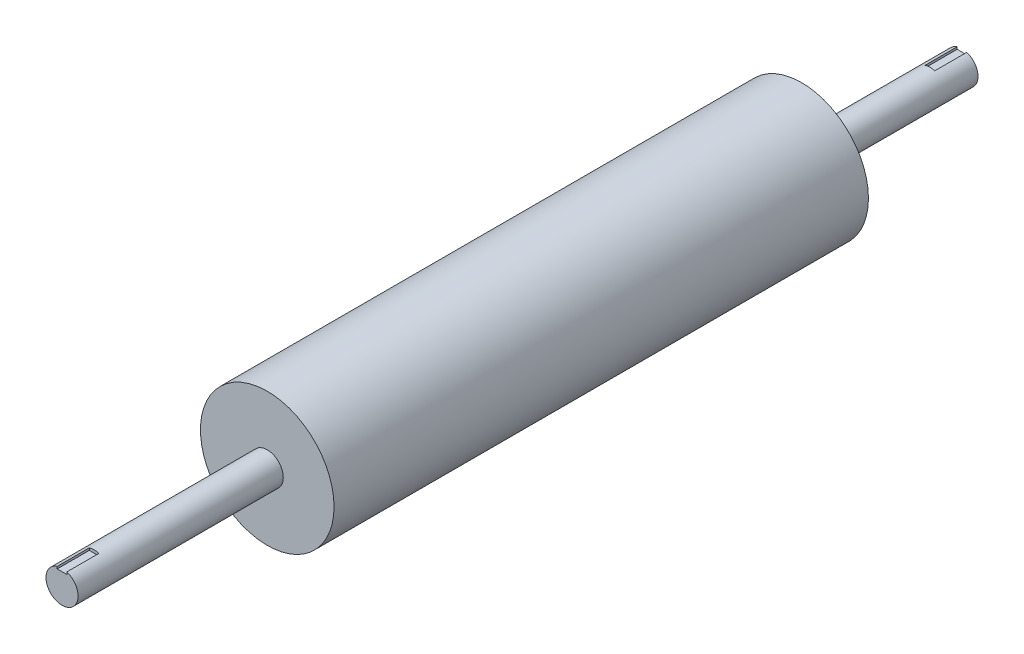
ISO-10303-21;
HEADER;
FILE_DESCRIPTION(('STEP AP214'),'2;1');
FILE_NAME('part.step','',(''),(''),'','','');
FILE_SCHEMA(('AUTOMOTIVE_DESIGN { 1 0 10303 214 1 1 1 1 }'));
ENDSEC;
DATA;
#1=APPLICATION_CONTEXT('core data for automotive mechanical design processes');
#2=APPLICATION_PROTOCOL_DEFINITION('international standard','automotive_design',2000,#1);
#3=PRODUCT_CONTEXT('',#1,'mechanical');
#4=PRODUCT('Part','Part','',(#3));
#5=PRODUCT_RELATED_PRODUCT_CATEGORY('part','',(#4));
#6=PRODUCT_DEFINITION_FORMATION('','',#4);
#7=PRODUCT_DEFINITION_CONTEXT('part definition',#1,'design');
#8=PRODUCT_DEFINITION('design','',#6,#7);
#9=PRODUCT_DEFINITION_SHAPE('','',#8);
#10=(LENGTH_UNIT() NAMED_UNIT(*) SI_UNIT(.MILLI.,.METRE.));
#11=(NAMED_UNIT(*) PLANE_ANGLE_UNIT() SI_UNIT($,.RADIAN.));
#12=(NAMED_UNIT(*) SI_UNIT($,.STERADIAN.) SOLID_ANGLE_UNIT());
#13=UNCERTAINTY_MEASURE_WITH_UNIT(LENGTH_MEASURE(1.E-05),#10,'distance_accuracy_value','');
#14=(GEOMETRIC_REPRESENTATION_CONTEXT(3) GLOBAL_UNCERTAINTY_ASSIGNED_CONTEXT((#13)) GLOBAL_UNIT_ASSIGNED_CONTEXT((#10,
#11,#12)) REPRESENTATION_CONTEXT('',''));
#15=CARTESIAN_POINT('',(0.,0.,0.));
#16=DIRECTION('',(0.,0.,1.));
#17=DIRECTION('',(1.,0.,0.));
#18=AXIS2_PLACEMENT_3D('',#15,#16,#17);
#19=CARTESIAN_POINT('',(0.,0.,1000.));
#20=DIRECTION('',(0.,0.,-1.));
#21=DIRECTION('',(-1.,0.,0.));
#22=AXIS2_PLACEMENT_3D('',#19,#20,#21);
#23=CYLINDRICAL_SURFACE('',#22,125.);
#24=CARTESIAN_POINT('',(0.,0.,1000.));
#25=DIRECTION('',(0.,0.,1.));
#26=DIRECTION('',(1.,0.,0.));
#27=AXIS2_PLACEMENT_3D('',#24,#25,#26);
#28=CIRCLE('',#27,125.);
#29=CARTESIAN_POINT('',(125.,0.,1000.));
#30=VERTEX_POINT('',#29);
#31=EDGE_CURVE('E206',#30,#30,#28,.T.);
#32=ORIENTED_EDGE('',*,*,#31,.F.);
#33=EDGE_LOOP('',(#32));
#34=FACE_BOUND('',#33,.T.);
#35=CARTESIAN_POINT('',(0.,0.,0.));
#36=DIRECTION('',(0.,0.,1.));
#37=DIRECTION('',(1.,0.,0.));
#38=AXIS2_PLACEMENT_3D('',#35,#36,#37);
#39=CIRCLE('',#38,125.);
#40=CARTESIAN_POINT('',(125.,0.,0.));
#41=VERTEX_POINT('',#40);
#42=EDGE_CURVE('E202',#41,#41,#39,.T.);
#43=ORIENTED_EDGE('',*,*,#42,.T.);
#44=EDGE_LOOP('',(#43));
#45=FACE_BOUND('',#44,.T.);
#46=ADVANCED_FACE('F53',(#34,#45),#23,.T.);
#47=CARTESIAN_POINT('',(0.,0.,1000.));
#48=DIRECTION('',(0.,0.,1.));
#49=DIRECTION('',(1.,0.,0.));
#50=AXIS2_PLACEMENT_3D('',#47,#48,#49);
#51=PLANE('',#50);
#52=CARTESIAN_POINT('',(0.,0.,1000.));
#53=DIRECTION('',(0.,0.,1.));
#54=DIRECTION('',(1.,0.,0.));
#55=AXIS2_PLACEMENT_3D('',#52,#53,#54);
#56=CIRCLE('',#55,30.);
#57=CARTESIAN_POINT('',(30.,0.,1000.));
#58=VERTEX_POINT('',#57);
#59=EDGE_CURVE('E198',#58,#58,#56,.T.);
#60=ORIENTED_EDGE('',*,*,#59,.F.);
#61=EDGE_LOOP('',(#60));
#62=FACE_BOUND('',#61,.T.);
#63=ORIENTED_EDGE('',*,*,#31,.T.);
#64=EDGE_LOOP('',(#63));
#65=FACE_BOUND('',#64,.T.);
#66=ADVANCED_FACE('F250',(#62,#65),#51,.T.);
#67=CARTESIAN_POINT('',(0.,0.,0.));
#68=DIRECTION('',(0.,0.,1.));
#69=DIRECTION('',(1.,0.,0.));
#70=AXIS2_PLACEMENT_3D('',#67,#68,#69);
#71=PLANE('',#70);
#72=CARTESIAN_POINT('',(0.,0.,0.));
#73=DIRECTION('',(0.,0.,-1.));
#74=DIRECTION('',(-1.,0.,0.));
#75=AXIS2_PLACEMENT_3D('',#72,#73,#74);
#76=CIRCLE('',#75,30.);
#77=CARTESIAN_POINT('',(-30.,0.,0.));
#78=VERTEX_POINT('',#77);
#79=EDGE_CURVE('E193',#78,#78,#76,.T.);
#80=ORIENTED_EDGE('',*,*,#79,.F.);
#81=EDGE_LOOP('',(#80));
#82=FACE_BOUND('',#81,.T.);
#83=ORIENTED_EDGE('',*,*,#42,.F.);
#84=EDGE_LOOP('',(#83));
#85=FACE_BOUND('',#84,.T.);
#86=ADVANCED_FACE('F247',(#82,#85),#71,.F.);
#87=CARTESIAN_POINT('',(0.,0.,1384.03));
#88=DIRECTION('',(0.,0.,-1.));
#89=DIRECTION('',(-1.,0.,0.));
#90=AXIS2_PLACEMENT_3D('',#87,#88,#89);
#91=CYLINDRICAL_SURFACE('',#90,30.);
#92=CARTESIAN_POINT('',(0.,0.,1324.03));
#93=DIRECTION('',(0.,0.,-1.));
#94=DIRECTION('',(-1.,0.,0.));
#95=AXIS2_PLACEMENT_3D('',#92,#93,#94);
#96=CIRCLE('',#95,30.);
#97=CARTESIAN_POINT('',(-9.00000000000001,28.6181760425084,1324.03));
#98=VERTEX_POINT('',#97);
#99=CARTESIAN_POINT('',(8.99999999999999,28.6181760425084,1324.03));
#100=VERTEX_POINT('',#99);
#101=EDGE_CURVE('E215',#98,#100,#96,.T.);
#102=ORIENTED_EDGE('',*,*,#101,.T.);
#103=DIRECTION('',(0.,0.,-1.));
#104=VECTOR('',#103,1.);
#105=CARTESIAN_POINT('',(8.99999999999999,28.6181760425084,1384.03));
#106=LINE('',#105,#104);
#107=CARTESIAN_POINT('',(8.99999999999999,28.6181760425084,1384.03));
#108=VERTEX_POINT('',#107);
#109=EDGE_CURVE('E184',#100,#108,#106,.F.);
#110=ORIENTED_EDGE('',*,*,#109,.T.);
#111=CARTESIAN_POINT('',(0.,0.,1384.03));
#112=DIRECTION('',(0.,0.,1.));
#113=DIRECTION('',(1.,0.,0.));
#114=AXIS2_PLACEMENT_3D('',#111,#112,#113);
#115=CIRCLE('',#114,30.);
#116=CARTESIAN_POINT('',(-9.00000000000001,28.6181760425084,1384.03));
#117=VERTEX_POINT('',#116);
#118=EDGE_CURVE('E192',#117,#108,#115,.T.);
#119=ORIENTED_EDGE('',*,*,#118,.F.);
#120=DIRECTION('',(0.,0.,-1.));
#121=VECTOR('',#120,1.);
#122=CARTESIAN_POINT('',(-9.00000000000001,28.6181760425084,1384.03));
#123=LINE('',#122,#121);
#124=EDGE_CURVE('E76',#117,#98,#123,.T.);
#125=ORIENTED_EDGE('',*,*,#124,.T.);
#126=EDGE_LOOP('',(#102,#110,#119,#125));
#127=FACE_BOUND('',#126,.T.);
#128=ORIENTED_EDGE('',*,*,#59,.T.);
#129=EDGE_LOOP('',(#128));
#130=FACE_BOUND('',#129,.T.);
#131=ADVANCED_FACE('F220',(#127,#130),#91,.T.);
#132=CARTESIAN_POINT('',(0.,0.,1384.03));
#133=DIRECTION('',(0.,0.,1.));
#134=DIRECTION('',(1.,0.,0.));
#135=AXIS2_PLACEMENT_3D('',#132,#133,#134);
#136=PLANE('',#135);
#137=DIRECTION('',(0.,1.,0.));
#138=VECTOR('',#137,1.);
#139=CARTESIAN_POINT('',(8.99999999999999,24.5,1384.03));
#140=LINE('',#139,#138);
#141=CARTESIAN_POINT('',(8.99999999999999,24.5,1384.03));
#142=VERTEX_POINT('',#141);
#143=EDGE_CURVE('E157',#142,#108,#140,.T.);
#144=ORIENTED_EDGE('',*,*,#143,.F.);
#145=DIRECTION('',(1.,0.,0.));
#146=VECTOR('',#145,1.);
#147=CARTESIAN_POINT('',(-9.00000000000001,24.5,1384.03));
#148=LINE('',#147,#146);
#149=CARTESIAN_POINT('',(-9.00000000000001,24.5,1384.03));
#150=VERTEX_POINT('',#149);
#151=EDGE_CURVE('E163',#150,#142,#148,.T.);
#152=ORIENTED_EDGE('',*,*,#151,.F.);
#153=DIRECTION('',(0.,-1.,0.));
#154=VECTOR('',#153,1.);
#155=CARTESIAN_POINT('',(-9.00000000000001,0.,1384.03));
#156=LINE('',#155,#154);
#157=EDGE_CURVE('E197',#117,#150,#156,.T.);
#158=ORIENTED_EDGE('',*,*,#157,.F.);
#159=ORIENTED_EDGE('',*,*,#118,.T.);
#160=EDGE_LOOP('',(#144,#152,#158,#159));
#161=FACE_BOUND('',#160,.T.);
#162=ADVANCED_FACE('F236',(#161),#136,.T.);
#163=CARTESIAN_POINT('',(0.,0.,-300.));
#164=DIRECTION('',(0.,0.,1.));
#165=DIRECTION('',(1.,0.,0.));
#166=AXIS2_PLACEMENT_3D('',#163,#164,#165);
#167=CYLINDRICAL_SURFACE('',#166,30.);
#168=CARTESIAN_POINT('',(0.,0.,-240.));
#169=DIRECTION('',(0.,0.,1.));
#170=DIRECTION('',(1.,0.,0.));
#171=AXIS2_PLACEMENT_3D('',#168,#169,#170);
#172=CIRCLE('',#171,30.);
#173=CARTESIAN_POINT('',(9.,28.6181760425084,-240.));
#174=VERTEX_POINT('',#173);
#175=CARTESIAN_POINT('',(-9.,28.6181760425084,-240.));
#176=VERTEX_POINT('',#175);
#177=EDGE_CURVE('E11',#174,#176,#172,.T.);
#178=ORIENTED_EDGE('',*,*,#177,.T.);
#179=DIRECTION('',(0.,0.,1.));
#180=VECTOR('',#179,1.);
#181=CARTESIAN_POINT('',(-9.,28.6181760425084,-300.));
#182=LINE('',#181,#180);
#183=CARTESIAN_POINT('',(-9.,28.6181760425084,-300.));
#184=VERTEX_POINT('',#183);
#185=EDGE_CURVE('E153',#176,#184,#182,.F.);
#186=ORIENTED_EDGE('',*,*,#185,.T.);
#187=CARTESIAN_POINT('',(0.,0.,-300.));
#188=DIRECTION('',(0.,0.,-1.));
#189=DIRECTION('',(-1.,0.,0.));
#190=AXIS2_PLACEMENT_3D('',#187,#188,#189);
#191=CIRCLE('',#190,30.);
#192=CARTESIAN_POINT('',(9.,28.6181760425084,-300.));
#193=VERTEX_POINT('',#192);
#194=EDGE_CURVE('E188',#193,#184,#191,.T.);
#195=ORIENTED_EDGE('',*,*,#194,.F.);
#196=DIRECTION('',(0.,0.,1.));
#197=VECTOR('',#196,1.);
#198=CARTESIAN_POINT('',(9.,28.6181760425084,-300.));
#199=LINE('',#198,#197);
#200=EDGE_CURVE('E68',#193,#174,#199,.T.);
#201=ORIENTED_EDGE('',*,*,#200,.T.);
#202=EDGE_LOOP('',(#178,#186,#195,#201));
#203=FACE_BOUND('',#202,.T.);
#204=ORIENTED_EDGE('',*,*,#79,.T.);
#205=EDGE_LOOP('',(#204));
#206=FACE_BOUND('',#205,.T.);
#207=ADVANCED_FACE('F238',(#203,#206),#167,.T.);
#208=CARTESIAN_POINT('',(0.,0.,-300.));
#209=DIRECTION('',(0.,0.,-1.));
#210=DIRECTION('',(-1.,0.,0.));
#211=AXIS2_PLACEMENT_3D('',#208,#209,#210);
#212=PLANE('',#211);
#213=DIRECTION('',(0.,1.,0.));
#214=VECTOR('',#213,1.);
#215=CARTESIAN_POINT('',(-9.,24.5,-300.));
#216=LINE('',#215,#214);
#217=CARTESIAN_POINT('',(-9.,24.5,-300.));
#218=VERTEX_POINT('',#217);
#219=EDGE_CURVE('E143',#218,#184,#216,.T.);
#220=ORIENTED_EDGE('',*,*,#219,.F.);
#221=DIRECTION('',(-1.,0.,0.));
#222=VECTOR('',#221,1.);
#223=CARTESIAN_POINT('',(9.,24.5,-300.));
#224=LINE('',#223,#222);
#225=CARTESIAN_POINT('',(9.,24.5,-300.));
#226=VERTEX_POINT('',#225);
#227=EDGE_CURVE('E146',#226,#218,#224,.T.);
#228=ORIENTED_EDGE('',*,*,#227,.F.);
#229=DIRECTION('',(0.,-1.,0.));
#230=VECTOR('',#229,1.);
#231=CARTESIAN_POINT('',(9.,0.,-300.));
#232=LINE('',#231,#230);
#233=EDGE_CURVE('E61',#193,#226,#232,.T.);
#234=ORIENTED_EDGE('',*,*,#233,.F.);
#235=ORIENTED_EDGE('',*,*,#194,.T.);
#236=EDGE_LOOP('',(#220,#228,#234,#235));
#237=FACE_BOUND('',#236,.T.);
#238=ADVANCED_FACE('F244',(#237),#212,.T.);
#239=CARTESIAN_POINT('',(0.,0.,1324.03));
#240=DIRECTION('',(0.,0.,-1.));
#241=DIRECTION('',(-1.,0.,0.));
#242=AXIS2_PLACEMENT_3D('',#239,#240,#241);
#243=PLANE('',#242);
#244=DIRECTION('',(0.,-1.,0.));
#245=VECTOR('',#244,1.);
#246=CARTESIAN_POINT('',(-9.00000000000001,24.5,1324.03));
#247=LINE('',#246,#245);
#248=CARTESIAN_POINT('',(-9.00000000000001,24.5,1324.03));
#249=VERTEX_POINT('',#248);
#250=EDGE_CURVE('E162',#98,#249,#247,.T.);
#251=ORIENTED_EDGE('',*,*,#250,.T.);
#252=DIRECTION('',(1.,0.,0.));
#253=VECTOR('',#252,1.);
#254=CARTESIAN_POINT('',(-9.00000000000001,24.5,1324.03));
#255=LINE('',#254,#253);
#256=CARTESIAN_POINT('',(8.99999999999999,24.5,1324.03));
#257=VERTEX_POINT('',#256);
#258=EDGE_CURVE('E166',#249,#257,#255,.T.);
#259=ORIENTED_EDGE('',*,*,#258,.T.);
#260=DIRECTION('',(0.,1.,0.));
#261=VECTOR('',#260,1.);
#262=CARTESIAN_POINT('',(8.99999999999999,24.5,1324.03));
#263=LINE('',#262,#261);
#264=EDGE_CURVE('E158',#257,#100,#263,.T.);
#265=ORIENTED_EDGE('',*,*,#264,.T.);
#266=ORIENTED_EDGE('',*,*,#101,.F.);
#267=EDGE_LOOP('',(#251,#259,#265,#266));
#268=FACE_BOUND('',#267,.T.);
#269=ADVANCED_FACE('F224',(#268),#243,.F.);
#270=CARTESIAN_POINT('',(8.99999999999999,24.5,1324.03));
#271=DIRECTION('',(1.,0.,0.));
#272=DIRECTION('',(0.,0.,-1.));
#273=AXIS2_PLACEMENT_3D('',#270,#271,#272);
#274=PLANE('',#273);
#275=ORIENTED_EDGE('',*,*,#264,.F.);
#276=DIRECTION('',(0.,0.,1.));
#277=VECTOR('',#276,1.);
#278=CARTESIAN_POINT('',(8.99999999999999,24.5,1324.03));
#279=LINE('',#278,#277);
#280=EDGE_CURVE('E176',#257,#142,#279,.T.);
#281=ORIENTED_EDGE('',*,*,#280,.T.);
#282=ORIENTED_EDGE('',*,*,#143,.T.);
#283=ORIENTED_EDGE('',*,*,#109,.F.);
#284=EDGE_LOOP('',(#275,#281,#282,#283));
#285=FACE_BOUND('',#284,.T.);
#286=ADVANCED_FACE('F234',(#285),#274,.F.);
#287=CARTESIAN_POINT('',(-9.00000000000001,24.5,1324.03));
#288=DIRECTION('',(-1.,0.,0.));
#289=DIRECTION('',(0.,0.,1.));
#290=AXIS2_PLACEMENT_3D('',#287,#288,#289);
#291=PLANE('',#290);
#292=ORIENTED_EDGE('',*,*,#157,.T.);
#293=DIRECTION('',(0.,0.,1.));
#294=VECTOR('',#293,1.);
#295=CARTESIAN_POINT('',(-9.00000000000001,24.5,1324.03));
#296=LINE('',#295,#294);
#297=EDGE_CURVE('E170',#249,#150,#296,.T.);
#298=ORIENTED_EDGE('',*,*,#297,.F.);
#299=ORIENTED_EDGE('',*,*,#250,.F.);
#300=ORIENTED_EDGE('',*,*,#124,.F.);
#301=EDGE_LOOP('',(#292,#298,#299,#300));
#302=FACE_BOUND('',#301,.T.);
#303=ADVANCED_FACE('F227',(#302),#291,.F.);
#304=CARTESIAN_POINT('',(-9.00000000000001,24.5,1324.03));
#305=DIRECTION('',(0.,-1.,0.));
#306=DIRECTION('',(0.,0.,-1.));
#307=AXIS2_PLACEMENT_3D('',#304,#305,#306);
#308=PLANE('',#307);
#309=ORIENTED_EDGE('',*,*,#151,.T.);
#310=ORIENTED_EDGE('',*,*,#280,.F.);
#311=ORIENTED_EDGE('',*,*,#258,.F.);
#312=ORIENTED_EDGE('',*,*,#297,.T.);
#313=EDGE_LOOP('',(#309,#310,#311,#312));
#314=FACE_BOUND('',#313,.T.);
#315=ADVANCED_FACE('F231',(#314),#308,.F.);
#316=CARTESIAN_POINT('',(0.,0.,-240.));
#317=DIRECTION('',(0.,0.,1.));
#318=DIRECTION('',(1.,0.,0.));
#319=AXIS2_PLACEMENT_3D('',#316,#317,#318);
#320=PLANE('',#319);
#321=DIRECTION('',(0.,-1.,0.));
#322=VECTOR('',#321,1.);
#323=CARTESIAN_POINT('',(9.,24.5,-240.));
#324=LINE('',#323,#322);
#325=CARTESIAN_POINT('',(9.,24.5,-240.));
#326=VERTEX_POINT('',#325);
#327=EDGE_CURVE('E119',#174,#326,#324,.T.);
#328=ORIENTED_EDGE('',*,*,#327,.T.);
#329=DIRECTION('',(-1.,0.,0.));
#330=VECTOR('',#329,1.);
#331=CARTESIAN_POINT('',(9.,24.5,-240.));
#332=LINE('',#331,#330);
#333=CARTESIAN_POINT('',(-9.,24.5,-240.));
#334=VERTEX_POINT('',#333);
#335=EDGE_CURVE('E124',#326,#334,#332,.T.);
#336=ORIENTED_EDGE('',*,*,#335,.T.);
#337=DIRECTION('',(0.,1.,0.));
#338=VECTOR('',#337,1.);
#339=CARTESIAN_POINT('',(-9.,24.5,-240.));
#340=LINE('',#339,#338);
#341=EDGE_CURVE('E126',#334,#176,#340,.T.);
#342=ORIENTED_EDGE('',*,*,#341,.T.);
#343=ORIENTED_EDGE('',*,*,#177,.F.);
#344=EDGE_LOOP('',(#328,#336,#342,#343));
#345=FACE_BOUND('',#344,.T.);
#346=ADVANCED_FACE('F121',(#345),#320,.F.);
#347=CARTESIAN_POINT('',(-9.,24.5,-240.));
#348=DIRECTION('',(-1.,0.,0.));
#349=DIRECTION('',(0.,0.,1.));
#350=AXIS2_PLACEMENT_3D('',#347,#348,#349);
#351=PLANE('',#350);
#352=ORIENTED_EDGE('',*,*,#341,.F.);
#353=DIRECTION('',(0.,0.,-1.));
#354=VECTOR('',#353,1.);
#355=CARTESIAN_POINT('',(-9.,24.5,-240.));
#356=LINE('',#355,#354);
#357=EDGE_CURVE('E135',#334,#218,#356,.T.);
#358=ORIENTED_EDGE('',*,*,#357,.T.);
#359=ORIENTED_EDGE('',*,*,#219,.T.);
#360=ORIENTED_EDGE('',*,*,#185,.F.);
#361=EDGE_LOOP('',(#352,#358,#359,#360));
#362=FACE_BOUND('',#361,.T.);
#363=ADVANCED_FACE('F310',(#362),#351,.F.);
#364=CARTESIAN_POINT('',(9.,24.5,-240.));
#365=DIRECTION('',(1.,0.,0.));
#366=DIRECTION('',(0.,0.,-1.));
#367=AXIS2_PLACEMENT_3D('',#364,#365,#366);
#368=PLANE('',#367);
#369=ORIENTED_EDGE('',*,*,#233,.T.);
#370=DIRECTION('',(0.,0.,-1.));
#371=VECTOR('',#370,1.);
#372=CARTESIAN_POINT('',(9.,24.5,-240.));
#373=LINE('',#372,#371);
#374=EDGE_CURVE('E129',#326,#226,#373,.T.);
#375=ORIENTED_EDGE('',*,*,#374,.F.);
#376=ORIENTED_EDGE('',*,*,#327,.F.);
#377=ORIENTED_EDGE('',*,*,#200,.F.);
#378=EDGE_LOOP('',(#369,#375,#376,#377));
#379=FACE_BOUND('',#378,.T.);
#380=ADVANCED_FACE('F130',(#379),#368,.F.);
#381=CARTESIAN_POINT('',(9.,24.5,-240.));
#382=DIRECTION('',(0.,-1.,0.));
#383=DIRECTION('',(0.,0.,-1.));
#384=AXIS2_PLACEMENT_3D('',#381,#382,#383);
#385=PLANE('',#384);
#386=ORIENTED_EDGE('',*,*,#227,.T.);
#387=ORIENTED_EDGE('',*,*,#357,.F.);
#388=ORIENTED_EDGE('',*,*,#335,.F.);
#389=ORIENTED_EDGE('',*,*,#374,.T.);
#390=EDGE_LOOP('',(#386,#387,#388,#389));
#391=FACE_BOUND('',#390,.T.);
#392=ADVANCED_FACE('F137',(#391),#385,.F.);
#393=CLOSED_SHELL('',(#46,#66,#86,#131,#162,#207,#238,#269,#286,#303,#315,#346,#363,#380,#392));
#394=MANIFOLD_SOLID_BREP('B2',#393);
#395=ADVANCED_BREP_SHAPE_REPRESENTATION('',(#18,#394),#14);
#396=SHAPE_DEFINITION_REPRESENTATION(#9,#395);
ENDSEC;
END-ISO-10303-21;
